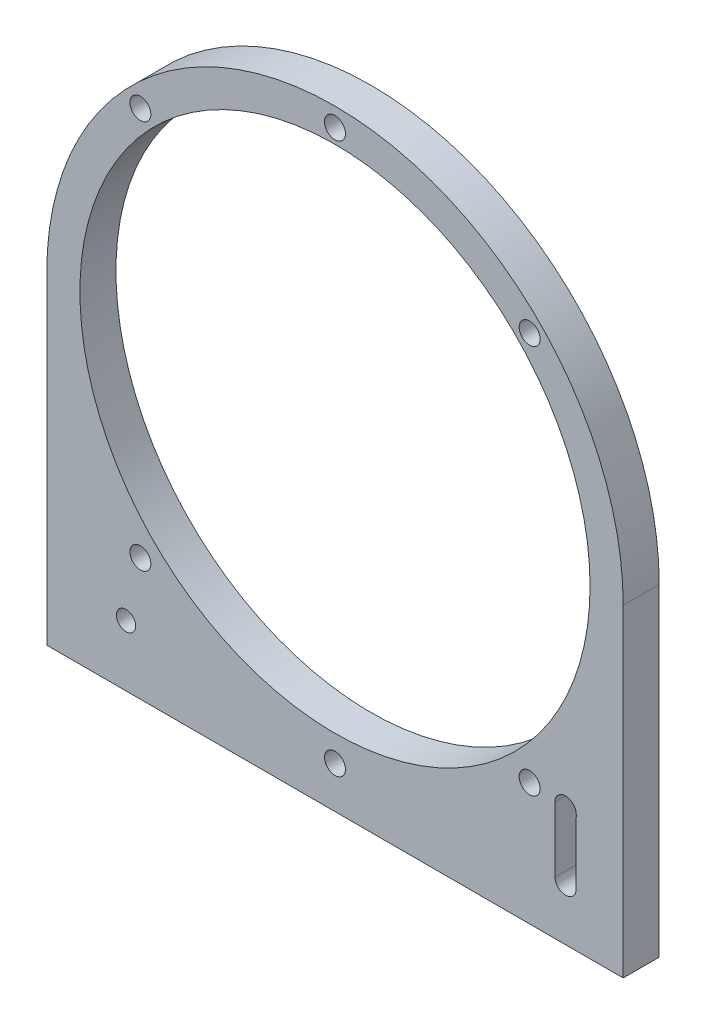
ISO-10303-21;
HEADER;
FILE_DESCRIPTION(('STEP AP214'),'2;1');
FILE_NAME('part.step','',(''),(''),'','','');
FILE_SCHEMA(('AUTOMOTIVE_DESIGN { 1 0 10303 214 1 1 1 1 }'));
ENDSEC;
DATA;
#1=APPLICATION_CONTEXT('core data for automotive mechanical design processes');
#2=APPLICATION_PROTOCOL_DEFINITION('international standard','automotive_design',2000,#1);
#3=PRODUCT_CONTEXT('',#1,'mechanical');
#4=PRODUCT('Part','Part','',(#3));
#5=PRODUCT_RELATED_PRODUCT_CATEGORY('part','',(#4));
#6=PRODUCT_DEFINITION_FORMATION('','',#4);
#7=PRODUCT_DEFINITION_CONTEXT('part definition',#1,'design');
#8=PRODUCT_DEFINITION('design','',#6,#7);
#9=PRODUCT_DEFINITION_SHAPE('','',#8);
#10=(LENGTH_UNIT() NAMED_UNIT(*) SI_UNIT(.MILLI.,.METRE.));
#11=(NAMED_UNIT(*) PLANE_ANGLE_UNIT() SI_UNIT($,.RADIAN.));
#12=(NAMED_UNIT(*) SI_UNIT($,.STERADIAN.) SOLID_ANGLE_UNIT());
#13=UNCERTAINTY_MEASURE_WITH_UNIT(LENGTH_MEASURE(1.E-05),#10,'distance_accuracy_value','');
#14=(GEOMETRIC_REPRESENTATION_CONTEXT(3) GLOBAL_UNCERTAINTY_ASSIGNED_CONTEXT((#13)) GLOBAL_UNIT_ASSIGNED_CONTEXT((#10,
#11,#12)) REPRESENTATION_CONTEXT('',''));
#15=CARTESIAN_POINT('',(0.,0.,0.));
#16=DIRECTION('',(0.,0.,1.));
#17=DIRECTION('',(1.,0.,0.));
#18=AXIS2_PLACEMENT_3D('',#15,#16,#17);
#19=CARTESIAN_POINT('',(0.,56.896,-6.35));
#20=DIRECTION('',(0.,0.,1.));
#21=DIRECTION('',(1.,0.,0.));
#22=AXIS2_PLACEMENT_3D('',#19,#20,#21);
#23=CYLINDRICAL_SURFACE('',#22,50.8);
#24=CARTESIAN_POINT('',(0.,56.896,0.));
#25=DIRECTION('',(0.,0.,1.));
#26=DIRECTION('',(1.,0.,0.));
#27=AXIS2_PLACEMENT_3D('',#24,#25,#26);
#28=CIRCLE('',#27,50.8);
#29=CARTESIAN_POINT('',(-50.8,56.896,0.));
#30=VERTEX_POINT('',#29);
#31=CARTESIAN_POINT('',(50.8,56.896,0.));
#32=VERTEX_POINT('',#31);
#33=EDGE_CURVE('E198',#30,#32,#28,.F.);
#34=ORIENTED_EDGE('',*,*,#33,.T.);
#35=DIRECTION('',(0.,0.,1.));
#36=VECTOR('',#35,1.);
#37=CARTESIAN_POINT('',(50.8,56.896,-6.35));
#38=LINE('',#37,#36);
#39=CARTESIAN_POINT('',(50.8,56.896,-6.35));
#40=VERTEX_POINT('',#39);
#41=EDGE_CURVE('E11',#40,#32,#38,.T.);
#42=ORIENTED_EDGE('',*,*,#41,.F.);
#43=CARTESIAN_POINT('',(0.,56.896,-6.35));
#44=DIRECTION('',(0.,0.,1.));
#45=DIRECTION('',(1.,0.,0.));
#46=AXIS2_PLACEMENT_3D('',#43,#44,#45);
#47=CIRCLE('',#46,50.8);
#48=CARTESIAN_POINT('',(-50.8,56.896,-6.35));
#49=VERTEX_POINT('',#48);
#50=EDGE_CURVE('E185',#49,#40,#47,.F.);
#51=ORIENTED_EDGE('',*,*,#50,.F.);
#52=DIRECTION('',(0.,0.,1.));
#53=VECTOR('',#52,1.);
#54=CARTESIAN_POINT('',(-50.8,56.896,-6.35));
#55=LINE('',#54,#53);
#56=EDGE_CURVE('E41',#49,#30,#55,.T.);
#57=ORIENTED_EDGE('',*,*,#56,.T.);
#58=EDGE_LOOP('',(#34,#42,#51,#57));
#59=FACE_BOUND('',#58,.T.);
#60=ADVANCED_FACE('F37',(#59),#23,.T.);
#61=CARTESIAN_POINT('',(50.8,0.,-6.35));
#62=DIRECTION('',(1.,0.,0.));
#63=DIRECTION('',(0.,0.,-1.));
#64=AXIS2_PLACEMENT_3D('',#61,#62,#63);
#65=PLANE('',#64);
#66=DIRECTION('',(0.,1.,0.));
#67=VECTOR('',#66,1.);
#68=CARTESIAN_POINT('',(50.8,0.,0.));
#69=LINE('',#68,#67);
#70=CARTESIAN_POINT('',(50.8,0.,0.));
#71=VERTEX_POINT('',#70);
#72=EDGE_CURVE('E186',#71,#32,#69,.T.);
#73=ORIENTED_EDGE('',*,*,#72,.F.);
#74=DIRECTION('',(0.,0.,1.));
#75=VECTOR('',#74,1.);
#76=CARTESIAN_POINT('',(50.8,0.,-6.35));
#77=LINE('',#76,#75);
#78=CARTESIAN_POINT('',(50.8,0.,-6.35));
#79=VERTEX_POINT('',#78);
#80=EDGE_CURVE('E46',#79,#71,#77,.T.);
#81=ORIENTED_EDGE('',*,*,#80,.F.);
#82=DIRECTION('',(0.,1.,0.));
#83=VECTOR('',#82,1.);
#84=CARTESIAN_POINT('',(50.8,0.,-6.35));
#85=LINE('',#84,#83);
#86=EDGE_CURVE('E193',#79,#40,#85,.T.);
#87=ORIENTED_EDGE('',*,*,#86,.T.);
#88=ORIENTED_EDGE('',*,*,#41,.T.);
#89=EDGE_LOOP('',(#73,#81,#87,#88));
#90=FACE_BOUND('',#89,.T.);
#91=ADVANCED_FACE('F223',(#90),#65,.T.);
#92=CARTESIAN_POINT('',(0.,0.,-6.35));
#93=DIRECTION('',(0.,-1.,0.));
#94=DIRECTION('',(0.,0.,-1.));
#95=AXIS2_PLACEMENT_3D('',#92,#93,#94);
#96=PLANE('',#95);
#97=DIRECTION('',(1.,0.,0.));
#98=VECTOR('',#97,1.);
#99=CARTESIAN_POINT('',(0.,0.,0.));
#100=LINE('',#99,#98);
#101=CARTESIAN_POINT('',(-50.8,0.,0.));
#102=VERTEX_POINT('',#101);
#103=EDGE_CURVE('E203',#102,#71,#100,.T.);
#104=ORIENTED_EDGE('',*,*,#103,.F.);
#105=DIRECTION('',(0.,0.,1.));
#106=VECTOR('',#105,1.);
#107=CARTESIAN_POINT('',(-50.8,0.,-6.35));
#108=LINE('',#107,#106);
#109=CARTESIAN_POINT('',(-50.8,0.,-6.35));
#110=VERTEX_POINT('',#109);
#111=EDGE_CURVE('E208',#110,#102,#108,.T.);
#112=ORIENTED_EDGE('',*,*,#111,.F.);
#113=DIRECTION('',(1.,0.,0.));
#114=VECTOR('',#113,1.);
#115=CARTESIAN_POINT('',(0.,0.,-6.35));
#116=LINE('',#115,#114);
#117=EDGE_CURVE('E190',#110,#79,#116,.T.);
#118=ORIENTED_EDGE('',*,*,#117,.T.);
#119=ORIENTED_EDGE('',*,*,#80,.T.);
#120=EDGE_LOOP('',(#104,#112,#118,#119));
#121=FACE_BOUND('',#120,.T.);
#122=ADVANCED_FACE('F235',(#121),#96,.T.);
#123=CARTESIAN_POINT('',(0.,56.896,-6.35));
#124=DIRECTION('',(0.,0.,1.));
#125=DIRECTION('',(1.,0.,0.));
#126=AXIS2_PLACEMENT_3D('',#123,#124,#125);
#127=CYLINDRICAL_SURFACE('',#126,44.958);
#128=CARTESIAN_POINT('',(0.,56.896,-6.35));
#129=DIRECTION('',(0.,0.,1.));
#130=DIRECTION('',(1.,0.,0.));
#131=AXIS2_PLACEMENT_3D('',#128,#129,#130);
#132=CIRCLE('',#131,44.958);
#133=CARTESIAN_POINT('',(44.958,56.896,-6.35));
#134=VERTEX_POINT('',#133);
#135=EDGE_CURVE('E182',#134,#134,#132,.T.);
#136=ORIENTED_EDGE('',*,*,#135,.F.);
#137=EDGE_LOOP('',(#136));
#138=FACE_BOUND('',#137,.T.);
#139=CARTESIAN_POINT('',(0.,56.896,0.));
#140=DIRECTION('',(0.,0.,1.));
#141=DIRECTION('',(1.,0.,0.));
#142=AXIS2_PLACEMENT_3D('',#139,#140,#141);
#143=CIRCLE('',#142,44.958);
#144=CARTESIAN_POINT('',(44.958,56.896,0.));
#145=VERTEX_POINT('',#144);
#146=EDGE_CURVE('E181',#145,#145,#143,.T.);
#147=ORIENTED_EDGE('',*,*,#146,.T.);
#148=EDGE_LOOP('',(#147));
#149=FACE_BOUND('',#148,.T.);
#150=ADVANCED_FACE('F39',(#138,#149),#127,.F.);
#151=CARTESIAN_POINT('',(-50.8,0.,-6.35));
#152=DIRECTION('',(1.,0.,0.));
#153=DIRECTION('',(0.,0.,-1.));
#154=AXIS2_PLACEMENT_3D('',#151,#152,#153);
#155=PLANE('',#154);
#156=DIRECTION('',(0.,1.,0.));
#157=VECTOR('',#156,1.);
#158=CARTESIAN_POINT('',(-50.8,0.,0.));
#159=LINE('',#158,#157);
#160=EDGE_CURVE('E201',#102,#30,#159,.T.);
#161=ORIENTED_EDGE('',*,*,#160,.T.);
#162=ORIENTED_EDGE('',*,*,#56,.F.);
#163=DIRECTION('',(0.,1.,0.));
#164=VECTOR('',#163,1.);
#165=CARTESIAN_POINT('',(-50.8,0.,-6.35));
#166=LINE('',#165,#164);
#167=EDGE_CURVE('E188',#110,#49,#166,.T.);
#168=ORIENTED_EDGE('',*,*,#167,.F.);
#169=ORIENTED_EDGE('',*,*,#111,.T.);
#170=EDGE_LOOP('',(#161,#162,#168,#169));
#171=FACE_BOUND('',#170,.T.);
#172=ADVANCED_FACE('F227',(#171),#155,.F.);
#173=CARTESIAN_POINT('',(0.,0.,-6.35));
#174=DIRECTION('',(0.,0.,1.));
#175=DIRECTION('',(1.,0.,0.));
#176=AXIS2_PLACEMENT_3D('',#173,#174,#175);
#177=PLANE('',#176);
#178=DIRECTION('',(0.00306210287938057,0.999995311751988,0.));
#179=VECTOR('',#178,1.);
#180=CARTESIAN_POINT('',(42.4608240856742,-0.130020021259721,-6.35));
#181=LINE('',#180,#179);
#182=CARTESIAN_POINT('',(42.49,9.398,-6.35));
#183=VERTEX_POINT('',#182);
#184=CARTESIAN_POINT('',(42.525,20.828,-6.35));
#185=VERTEX_POINT('',#184);
#186=EDGE_CURVE('E123',#183,#185,#181,.T.);
#187=ORIENTED_EDGE('',*,*,#186,.T.);
#188=CARTESIAN_POINT('',(40.64,20.828,-6.35));
#189=DIRECTION('',(0.,0.,1.));
#190=DIRECTION('',(1.,0.,0.));
#191=AXIS2_PLACEMENT_3D('',#188,#189,#190);
#192=CIRCLE('',#191,1.885);
#193=CARTESIAN_POINT('',(38.755,20.828,-6.35));
#194=VERTEX_POINT('',#193);
#195=EDGE_CURVE('E105',#194,#185,#192,.F.);
#196=ORIENTED_EDGE('',*,*,#195,.F.);
#197=DIRECTION('',(-0.00306210287938057,0.999995311751988,0.));
#198=VECTOR('',#197,1.);
#199=CARTESIAN_POINT('',(38.8184137945155,0.118866533928964,-6.35));
#200=LINE('',#199,#198);
#201=CARTESIAN_POINT('',(38.79,9.398,-6.35));
#202=VERTEX_POINT('',#201);
#203=EDGE_CURVE('E114',#202,#194,#200,.T.);
#204=ORIENTED_EDGE('',*,*,#203,.F.);
#205=CARTESIAN_POINT('',(40.64,9.398,-6.35));
#206=DIRECTION('',(0.,0.,1.));
#207=DIRECTION('',(1.,0.,0.));
#208=AXIS2_PLACEMENT_3D('',#205,#206,#207);
#209=CIRCLE('',#208,1.85);
#210=EDGE_CURVE('E54',#183,#202,#209,.F.);
#211=ORIENTED_EDGE('',*,*,#210,.F.);
#212=EDGE_LOOP('',(#187,#196,#204,#211));
#213=FACE_BOUND('',#212,.T.);
#214=CARTESIAN_POINT('',(0.,104.394,-6.35));
#215=DIRECTION('',(0.,0.,1.));
#216=DIRECTION('',(1.,0.,0.));
#217=AXIS2_PLACEMENT_3D('',#214,#215,#216);
#218=CIRCLE('',#217,1.85);
#219=CARTESIAN_POINT('',(1.85,104.394,-6.35));
#220=VERTEX_POINT('',#219);
#221=EDGE_CURVE('E142',#220,#220,#218,.T.);
#222=ORIENTED_EDGE('',*,*,#221,.T.);
#223=EDGE_LOOP('',(#222));
#224=FACE_BOUND('',#223,.T.);
#225=CARTESIAN_POINT('',(34.3045783824899,90.1845783824977,-6.35));
#226=DIRECTION('',(0.,0.,1.));
#227=DIRECTION('',(1.,0.,0.));
#228=AXIS2_PLACEMENT_3D('',#225,#226,#227);
#229=CIRCLE('',#228,1.84999999999999);
#230=CARTESIAN_POINT('',(36.1545783824899,90.1845783824977,-6.35));
#231=VERTEX_POINT('',#230);
#232=EDGE_CURVE('E148',#231,#231,#229,.T.);
#233=ORIENTED_EDGE('',*,*,#232,.T.);
#234=EDGE_LOOP('',(#233));
#235=FACE_BOUND('',#234,.T.);
#236=CARTESIAN_POINT('',(34.3045783825169,21.5754216175293,-6.35));
#237=DIRECTION('',(0.,0.,1.));
#238=DIRECTION('',(1.,0.,0.));
#239=AXIS2_PLACEMENT_3D('',#236,#237,#238);
#240=CIRCLE('',#239,1.84999999999999);
#241=CARTESIAN_POINT('',(36.1545783825169,21.5754216175293,-6.35));
#242=VERTEX_POINT('',#241);
#243=EDGE_CURVE('E154',#242,#242,#240,.T.);
#244=ORIENTED_EDGE('',*,*,#243,.T.);
#245=EDGE_LOOP('',(#244));
#246=FACE_BOUND('',#245,.T.);
#247=CARTESIAN_POINT('',(3.82512275107959E-11,7.366,-6.35));
#248=DIRECTION('',(0.,0.,1.));
#249=DIRECTION('',(1.,0.,0.));
#250=AXIS2_PLACEMENT_3D('',#247,#248,#249);
#251=CIRCLE('',#250,1.85);
#252=CARTESIAN_POINT('',(1.85000000003825,7.366,-6.35));
#253=VERTEX_POINT('',#252);
#254=EDGE_CURVE('E160',#253,#253,#251,.T.);
#255=ORIENTED_EDGE('',*,*,#254,.T.);
#256=EDGE_LOOP('',(#255));
#257=FACE_BOUND('',#256,.T.);
#258=CARTESIAN_POINT('',(-34.3045783824515,21.5754216175025,-6.35));
#259=DIRECTION('',(0.,0.,1.));
#260=DIRECTION('',(1.,0.,0.));
#261=AXIS2_PLACEMENT_3D('',#258,#259,#260);
#262=CIRCLE('',#261,1.84999999999999);
#263=CARTESIAN_POINT('',(-32.4545783824515,21.5754216175025,-6.35));
#264=VERTEX_POINT('',#263);
#265=EDGE_CURVE('E166',#264,#264,#262,.T.);
#266=ORIENTED_EDGE('',*,*,#265,.T.);
#267=EDGE_LOOP('',(#266));
#268=FACE_BOUND('',#267,.T.);
#269=CARTESIAN_POINT('',(-34.3045783824781,90.1845783824709,-6.35));
#270=DIRECTION('',(0.,0.,1.));
#271=DIRECTION('',(1.,0.,0.));
#272=AXIS2_PLACEMENT_3D('',#269,#270,#271);
#273=CIRCLE('',#272,1.84999999999999);
#274=CARTESIAN_POINT('',(-32.4545783824781,90.1845783824709,-6.35));
#275=VERTEX_POINT('',#274);
#276=EDGE_CURVE('E172',#275,#275,#273,.T.);
#277=ORIENTED_EDGE('',*,*,#276,.T.);
#278=EDGE_LOOP('',(#277));
#279=FACE_BOUND('',#278,.T.);
#280=CARTESIAN_POINT('',(-36.83,10.7442,-6.35));
#281=DIRECTION('',(0.,0.,1.));
#282=DIRECTION('',(1.,0.,0.));
#283=AXIS2_PLACEMENT_3D('',#280,#281,#282);
#284=CIRCLE('',#283,1.69999999999999);
#285=CARTESIAN_POINT('',(-35.13,10.7442,-6.35));
#286=VERTEX_POINT('',#285);
#287=EDGE_CURVE('E178',#286,#286,#284,.T.);
#288=ORIENTED_EDGE('',*,*,#287,.T.);
#289=EDGE_LOOP('',(#288));
#290=FACE_BOUND('',#289,.T.);
#291=ORIENTED_EDGE('',*,*,#135,.T.);
#292=EDGE_LOOP('',(#291));
#293=FACE_BOUND('',#292,.T.);
#294=ORIENTED_EDGE('',*,*,#50,.T.);
#295=ORIENTED_EDGE('',*,*,#86,.F.);
#296=ORIENTED_EDGE('',*,*,#117,.F.);
#297=ORIENTED_EDGE('',*,*,#167,.T.);
#298=EDGE_LOOP('',(#294,#295,#296,#297));
#299=FACE_BOUND('',#298,.T.);
#300=ADVANCED_FACE('F120',(#213,#224,#235,#246,#257,#268,#279,#290,#293,#299),#177,.F.);
#301=CARTESIAN_POINT('',(0.,0.,0.));
#302=DIRECTION('',(0.,0.,1.));
#303=DIRECTION('',(1.,0.,0.));
#304=AXIS2_PLACEMENT_3D('',#301,#302,#303);
#305=PLANE('',#304);
#306=CARTESIAN_POINT('',(40.64,20.828,0.));
#307=DIRECTION('',(0.,0.,1.));
#308=DIRECTION('',(1.,0.,0.));
#309=AXIS2_PLACEMENT_3D('',#306,#307,#308);
#310=CIRCLE('',#309,1.885);
#311=CARTESIAN_POINT('',(42.525,20.828,0.));
#312=VERTEX_POINT('',#311);
#313=CARTESIAN_POINT('',(38.755,20.828,0.));
#314=VERTEX_POINT('',#313);
#315=EDGE_CURVE('E62',#312,#314,#310,.T.);
#316=ORIENTED_EDGE('',*,*,#315,.F.);
#317=DIRECTION('',(-0.00306210287938057,-0.999995311751988,0.));
#318=VECTOR('',#317,1.);
#319=CARTESIAN_POINT('',(42.4608240856742,-0.130020021259721,0.));
#320=LINE('',#319,#318);
#321=CARTESIAN_POINT('',(42.49,9.398,0.));
#322=VERTEX_POINT('',#321);
#323=EDGE_CURVE('E111',#312,#322,#320,.T.);
#324=ORIENTED_EDGE('',*,*,#323,.T.);
#325=CARTESIAN_POINT('',(40.64,9.398,0.));
#326=DIRECTION('',(0.,0.,1.));
#327=DIRECTION('',(1.,0.,0.));
#328=AXIS2_PLACEMENT_3D('',#325,#326,#327);
#329=CIRCLE('',#328,1.85);
#330=CARTESIAN_POINT('',(38.79,9.398,0.));
#331=VERTEX_POINT('',#330);
#332=EDGE_CURVE('E131',#331,#322,#329,.T.);
#333=ORIENTED_EDGE('',*,*,#332,.F.);
#334=DIRECTION('',(0.00306210287938057,-0.999995311751988,0.));
#335=VECTOR('',#334,1.);
#336=CARTESIAN_POINT('',(38.8184137945155,0.118866533928964,0.));
#337=LINE('',#336,#335);
#338=EDGE_CURVE('E125',#314,#331,#337,.T.);
#339=ORIENTED_EDGE('',*,*,#338,.F.);
#340=EDGE_LOOP('',(#316,#324,#333,#339));
#341=FACE_BOUND('',#340,.T.);
#342=CARTESIAN_POINT('',(0.,104.394,0.));
#343=DIRECTION('',(0.,0.,1.));
#344=DIRECTION('',(1.,0.,0.));
#345=AXIS2_PLACEMENT_3D('',#342,#343,#344);
#346=CIRCLE('',#345,1.85);
#347=CARTESIAN_POINT('',(1.85,104.394,0.));
#348=VERTEX_POINT('',#347);
#349=EDGE_CURVE('E117',#348,#348,#346,.T.);
#350=ORIENTED_EDGE('',*,*,#349,.F.);
#351=EDGE_LOOP('',(#350));
#352=FACE_BOUND('',#351,.T.);
#353=CARTESIAN_POINT('',(34.3045783824899,90.1845783824977,0.));
#354=DIRECTION('',(0.,0.,1.));
#355=DIRECTION('',(1.,0.,0.));
#356=AXIS2_PLACEMENT_3D('',#353,#354,#355);
#357=CIRCLE('',#356,1.85);
#358=CARTESIAN_POINT('',(36.1545783824899,90.1845783824977,0.));
#359=VERTEX_POINT('',#358);
#360=EDGE_CURVE('E145',#359,#359,#357,.T.);
#361=ORIENTED_EDGE('',*,*,#360,.F.);
#362=EDGE_LOOP('',(#361));
#363=FACE_BOUND('',#362,.T.);
#364=CARTESIAN_POINT('',(34.3045783825169,21.5754216175293,0.));
#365=DIRECTION('',(0.,0.,1.));
#366=DIRECTION('',(1.,0.,0.));
#367=AXIS2_PLACEMENT_3D('',#364,#365,#366);
#368=CIRCLE('',#367,1.85);
#369=CARTESIAN_POINT('',(36.1545783825169,21.5754216175293,0.));
#370=VERTEX_POINT('',#369);
#371=EDGE_CURVE('E151',#370,#370,#368,.T.);
#372=ORIENTED_EDGE('',*,*,#371,.F.);
#373=EDGE_LOOP('',(#372));
#374=FACE_BOUND('',#373,.T.);
#375=CARTESIAN_POINT('',(3.82512275107959E-11,7.366,0.));
#376=DIRECTION('',(0.,0.,1.));
#377=DIRECTION('',(1.,0.,0.));
#378=AXIS2_PLACEMENT_3D('',#375,#376,#377);
#379=CIRCLE('',#378,1.85);
#380=CARTESIAN_POINT('',(1.85000000003825,7.366,0.));
#381=VERTEX_POINT('',#380);
#382=EDGE_CURVE('E157',#381,#381,#379,.T.);
#383=ORIENTED_EDGE('',*,*,#382,.F.);
#384=EDGE_LOOP('',(#383));
#385=FACE_BOUND('',#384,.T.);
#386=CARTESIAN_POINT('',(-34.3045783824515,21.5754216175025,0.));
#387=DIRECTION('',(0.,0.,1.));
#388=DIRECTION('',(1.,0.,0.));
#389=AXIS2_PLACEMENT_3D('',#386,#387,#388);
#390=CIRCLE('',#389,1.85);
#391=CARTESIAN_POINT('',(-32.4545783824515,21.5754216175025,0.));
#392=VERTEX_POINT('',#391);
#393=EDGE_CURVE('E163',#392,#392,#390,.T.);
#394=ORIENTED_EDGE('',*,*,#393,.F.);
#395=EDGE_LOOP('',(#394));
#396=FACE_BOUND('',#395,.T.);
#397=CARTESIAN_POINT('',(-34.3045783824781,90.1845783824709,0.));
#398=DIRECTION('',(0.,0.,1.));
#399=DIRECTION('',(1.,0.,0.));
#400=AXIS2_PLACEMENT_3D('',#397,#398,#399);
#401=CIRCLE('',#400,1.85);
#402=CARTESIAN_POINT('',(-32.4545783824781,90.1845783824709,0.));
#403=VERTEX_POINT('',#402);
#404=EDGE_CURVE('E169',#403,#403,#401,.T.);
#405=ORIENTED_EDGE('',*,*,#404,.F.);
#406=EDGE_LOOP('',(#405));
#407=FACE_BOUND('',#406,.T.);
#408=CARTESIAN_POINT('',(-36.83,10.7442,0.));
#409=DIRECTION('',(0.,0.,1.));
#410=DIRECTION('',(1.,0.,0.));
#411=AXIS2_PLACEMENT_3D('',#408,#409,#410);
#412=CIRCLE('',#411,1.69999999999999);
#413=CARTESIAN_POINT('',(-35.13,10.7442,0.));
#414=VERTEX_POINT('',#413);
#415=EDGE_CURVE('E175',#414,#414,#412,.T.);
#416=ORIENTED_EDGE('',*,*,#415,.F.);
#417=EDGE_LOOP('',(#416));
#418=FACE_BOUND('',#417,.T.);
#419=ORIENTED_EDGE('',*,*,#146,.F.);
#420=EDGE_LOOP('',(#419));
#421=FACE_BOUND('',#420,.T.);
#422=ORIENTED_EDGE('',*,*,#33,.F.);
#423=ORIENTED_EDGE('',*,*,#160,.F.);
#424=ORIENTED_EDGE('',*,*,#103,.T.);
#425=ORIENTED_EDGE('',*,*,#72,.T.);
#426=EDGE_LOOP('',(#422,#423,#424,#425));
#427=FACE_BOUND('',#426,.T.);
#428=ADVANCED_FACE('F219',(#341,#352,#363,#374,#385,#396,#407,#418,#421,#427),#305,.T.);
#429=CARTESIAN_POINT('',(-36.83,10.7442,0.));
#430=DIRECTION('',(0.,0.,1.));
#431=DIRECTION('',(1.,0.,0.));
#432=AXIS2_PLACEMENT_3D('',#429,#430,#431);
#433=CYLINDRICAL_SURFACE('',#432,1.69999999999999);
#434=ORIENTED_EDGE('',*,*,#415,.T.);
#435=EDGE_LOOP('',(#434));
#436=FACE_BOUND('',#435,.T.);
#437=ORIENTED_EDGE('',*,*,#287,.F.);
#438=EDGE_LOOP('',(#437));
#439=FACE_BOUND('',#438,.T.);
#440=ADVANCED_FACE('F249',(#436,#439),#433,.F.);
#441=CARTESIAN_POINT('',(-34.3045783824781,90.1845783824709,0.));
#442=DIRECTION('',(0.,0.,1.));
#443=DIRECTION('',(1.,0.,0.));
#444=AXIS2_PLACEMENT_3D('',#441,#442,#443);
#445=CYLINDRICAL_SURFACE('',#444,1.84999999999999);
#446=ORIENTED_EDGE('',*,*,#404,.T.);
#447=EDGE_LOOP('',(#446));
#448=FACE_BOUND('',#447,.T.);
#449=ORIENTED_EDGE('',*,*,#276,.F.);
#450=EDGE_LOOP('',(#449));
#451=FACE_BOUND('',#450,.T.);
#452=ADVANCED_FACE('F254',(#448,#451),#445,.F.);
#453=CARTESIAN_POINT('',(-34.3045783824515,21.5754216175025,0.));
#454=DIRECTION('',(0.,0.,1.));
#455=DIRECTION('',(1.,0.,0.));
#456=AXIS2_PLACEMENT_3D('',#453,#454,#455);
#457=CYLINDRICAL_SURFACE('',#456,1.84999999999999);
#458=ORIENTED_EDGE('',*,*,#393,.T.);
#459=EDGE_LOOP('',(#458));
#460=FACE_BOUND('',#459,.T.);
#461=ORIENTED_EDGE('',*,*,#265,.F.);
#462=EDGE_LOOP('',(#461));
#463=FACE_BOUND('',#462,.T.);
#464=ADVANCED_FACE('F258',(#460,#463),#457,.F.);
#465=CARTESIAN_POINT('',(3.82512275107959E-11,7.366,0.));
#466=DIRECTION('',(0.,0.,1.));
#467=DIRECTION('',(1.,0.,0.));
#468=AXIS2_PLACEMENT_3D('',#465,#466,#467);
#469=CYLINDRICAL_SURFACE('',#468,1.85);
#470=ORIENTED_EDGE('',*,*,#382,.T.);
#471=EDGE_LOOP('',(#470));
#472=FACE_BOUND('',#471,.T.);
#473=ORIENTED_EDGE('',*,*,#254,.F.);
#474=EDGE_LOOP('',(#473));
#475=FACE_BOUND('',#474,.T.);
#476=ADVANCED_FACE('F262',(#472,#475),#469,.F.);
#477=CARTESIAN_POINT('',(34.3045783825169,21.5754216175293,0.));
#478=DIRECTION('',(0.,0.,1.));
#479=DIRECTION('',(1.,0.,0.));
#480=AXIS2_PLACEMENT_3D('',#477,#478,#479);
#481=CYLINDRICAL_SURFACE('',#480,1.84999999999999);
#482=ORIENTED_EDGE('',*,*,#371,.T.);
#483=EDGE_LOOP('',(#482));
#484=FACE_BOUND('',#483,.T.);
#485=ORIENTED_EDGE('',*,*,#243,.F.);
#486=EDGE_LOOP('',(#485));
#487=FACE_BOUND('',#486,.T.);
#488=ADVANCED_FACE('F266',(#484,#487),#481,.F.);
#489=CARTESIAN_POINT('',(34.3045783824899,90.1845783824977,0.));
#490=DIRECTION('',(0.,0.,1.));
#491=DIRECTION('',(1.,0.,0.));
#492=AXIS2_PLACEMENT_3D('',#489,#490,#491);
#493=CYLINDRICAL_SURFACE('',#492,1.84999999999999);
#494=ORIENTED_EDGE('',*,*,#360,.T.);
#495=EDGE_LOOP('',(#494));
#496=FACE_BOUND('',#495,.T.);
#497=ORIENTED_EDGE('',*,*,#232,.F.);
#498=EDGE_LOOP('',(#497));
#499=FACE_BOUND('',#498,.T.);
#500=ADVANCED_FACE('F270',(#496,#499),#493,.F.);
#501=CARTESIAN_POINT('',(0.,104.394,0.));
#502=DIRECTION('',(0.,0.,1.));
#503=DIRECTION('',(1.,0.,0.));
#504=AXIS2_PLACEMENT_3D('',#501,#502,#503);
#505=CYLINDRICAL_SURFACE('',#504,1.85);
#506=ORIENTED_EDGE('',*,*,#349,.T.);
#507=EDGE_LOOP('',(#506));
#508=FACE_BOUND('',#507,.T.);
#509=ORIENTED_EDGE('',*,*,#221,.F.);
#510=EDGE_LOOP('',(#509));
#511=FACE_BOUND('',#510,.T.);
#512=ADVANCED_FACE('F274',(#508,#511),#505,.F.);
#513=CARTESIAN_POINT('',(40.64,20.828,-6.351));
#514=DIRECTION('',(0.,0.,1.));
#515=DIRECTION('',(1.,0.,0.));
#516=AXIS2_PLACEMENT_3D('',#513,#514,#515);
#517=CYLINDRICAL_SURFACE('',#516,1.885);
#518=ORIENTED_EDGE('',*,*,#195,.T.);
#519=DIRECTION('',(0.,0.,1.));
#520=VECTOR('',#519,1.);
#521=CARTESIAN_POINT('',(42.525,20.828,-6.351));
#522=LINE('',#521,#520);
#523=EDGE_CURVE('E118',#185,#312,#522,.T.);
#524=ORIENTED_EDGE('',*,*,#523,.T.);
#525=ORIENTED_EDGE('',*,*,#315,.T.);
#526=DIRECTION('',(0.,0.,1.));
#527=VECTOR('',#526,1.);
#528=CARTESIAN_POINT('',(38.755,20.828,-6.351));
#529=LINE('',#528,#527);
#530=EDGE_CURVE('E101',#194,#314,#529,.T.);
#531=ORIENTED_EDGE('',*,*,#530,.F.);
#532=EDGE_LOOP('',(#518,#524,#525,#531));
#533=FACE_BOUND('',#532,.T.);
#534=ADVANCED_FACE('F103',(#533),#517,.F.);
#535=CARTESIAN_POINT('',(42.4608240856742,-0.130020021259721,-6.351));
#536=DIRECTION('',(-0.999995311751988,0.00306210287938057,0.));
#537=DIRECTION('',(-0.00306210287938057,-0.999995311751988,0.));
#538=AXIS2_PLACEMENT_3D('',#535,#536,#537);
#539=PLANE('',#538);
#540=DIRECTION('',(0.,0.,1.));
#541=VECTOR('',#540,1.);
#542=CARTESIAN_POINT('',(42.49,9.398,-6.351));
#543=LINE('',#542,#541);
#544=EDGE_CURVE('E137',#183,#322,#543,.T.);
#545=ORIENTED_EDGE('',*,*,#544,.T.);
#546=ORIENTED_EDGE('',*,*,#323,.F.);
#547=ORIENTED_EDGE('',*,*,#523,.F.);
#548=ORIENTED_EDGE('',*,*,#186,.F.);
#549=EDGE_LOOP('',(#545,#546,#547,#548));
#550=FACE_BOUND('',#549,.T.);
#551=ADVANCED_FACE('F281',(#550),#539,.T.);
#552=CARTESIAN_POINT('',(40.64,9.398,-6.351));
#553=DIRECTION('',(0.,0.,1.));
#554=DIRECTION('',(1.,0.,0.));
#555=AXIS2_PLACEMENT_3D('',#552,#553,#554);
#556=CYLINDRICAL_SURFACE('',#555,1.85);
#557=ORIENTED_EDGE('',*,*,#210,.T.);
#558=DIRECTION('',(0.,0.,1.));
#559=VECTOR('',#558,1.);
#560=CARTESIAN_POINT('',(38.79,9.398,-6.351));
#561=LINE('',#560,#559);
#562=EDGE_CURVE('E110',#202,#331,#561,.T.);
#563=ORIENTED_EDGE('',*,*,#562,.T.);
#564=ORIENTED_EDGE('',*,*,#332,.T.);
#565=ORIENTED_EDGE('',*,*,#544,.F.);
#566=EDGE_LOOP('',(#557,#563,#564,#565));
#567=FACE_BOUND('',#566,.T.);
#568=ADVANCED_FACE('F284',(#567),#556,.F.);
#569=CARTESIAN_POINT('',(38.8184137945155,0.118866533928964,-6.351));
#570=DIRECTION('',(-0.999995311751988,-0.00306210287938057,0.));
#571=DIRECTION('',(0.00306210287938057,-0.999995311751988,0.));
#572=AXIS2_PLACEMENT_3D('',#569,#570,#571);
#573=PLANE('',#572);
#574=ORIENTED_EDGE('',*,*,#203,.T.);
#575=ORIENTED_EDGE('',*,*,#530,.T.);
#576=ORIENTED_EDGE('',*,*,#338,.T.);
#577=ORIENTED_EDGE('',*,*,#562,.F.);
#578=EDGE_LOOP('',(#574,#575,#576,#577));
#579=FACE_BOUND('',#578,.T.);
#580=ADVANCED_FACE('F115',(#579),#573,.F.);
#581=CLOSED_SHELL('',(#60,#91,#122,#150,#172,#300,#428,#440,#452,#464,#476,#488,#500,#512,#534,
#551,#568,#580));
#582=MANIFOLD_SOLID_BREP('B2',#581);
#583=ADVANCED_BREP_SHAPE_REPRESENTATION('',(#18,#582),#14);
#584=SHAPE_DEFINITION_REPRESENTATION(#9,#583);
ENDSEC;
END-ISO-10303-21;
